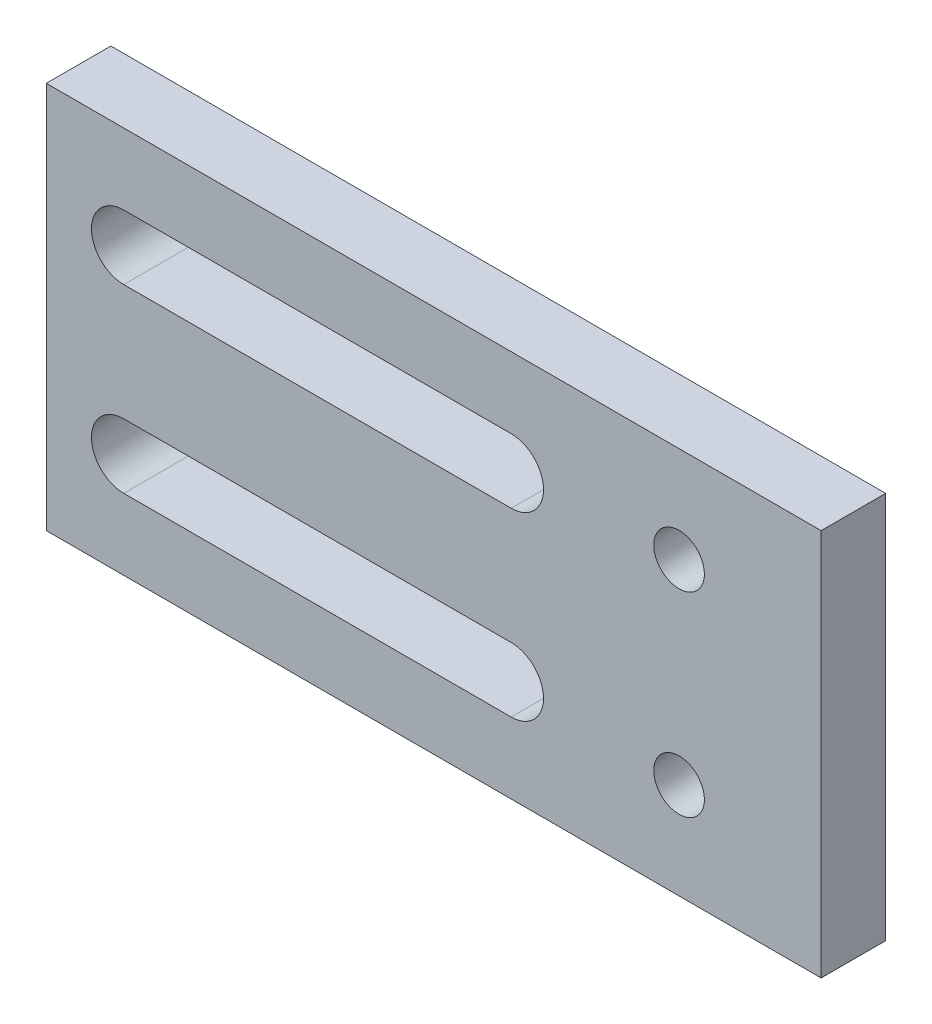
ISO-10303-21;
HEADER;
FILE_DESCRIPTION(('STEP AP214'),'2;1');
FILE_NAME('part.step','',(''),(''),'','','');
FILE_SCHEMA(('AUTOMOTIVE_DESIGN { 1 0 10303 214 1 1 1 1 }'));
ENDSEC;
DATA;
#1=APPLICATION_CONTEXT('core data for automotive mechanical design processes');
#2=APPLICATION_PROTOCOL_DEFINITION('international standard','automotive_design',2000,#1);
#3=PRODUCT_CONTEXT('',#1,'mechanical');
#4=PRODUCT('Part','Part','',(#3));
#5=PRODUCT_RELATED_PRODUCT_CATEGORY('part','',(#4));
#6=PRODUCT_DEFINITION_FORMATION('','',#4);
#7=PRODUCT_DEFINITION_CONTEXT('part definition',#1,'design');
#8=PRODUCT_DEFINITION('design','',#6,#7);
#9=PRODUCT_DEFINITION_SHAPE('','',#8);
#10=(LENGTH_UNIT() NAMED_UNIT(*) SI_UNIT(.MILLI.,.METRE.));
#11=(NAMED_UNIT(*) PLANE_ANGLE_UNIT() SI_UNIT($,.RADIAN.));
#12=(NAMED_UNIT(*) SI_UNIT($,.STERADIAN.) SOLID_ANGLE_UNIT());
#13=UNCERTAINTY_MEASURE_WITH_UNIT(LENGTH_MEASURE(1.E-05),#10,'distance_accuracy_value','');
#14=(GEOMETRIC_REPRESENTATION_CONTEXT(3) GLOBAL_UNCERTAINTY_ASSIGNED_CONTEXT((#13)) GLOBAL_UNIT_ASSIGNED_CONTEXT((#10,
#11,#12)) REPRESENTATION_CONTEXT('',''));
#15=CARTESIAN_POINT('',(0.,0.,0.));
#16=DIRECTION('',(0.,0.,1.));
#17=DIRECTION('',(1.,0.,0.));
#18=AXIS2_PLACEMENT_3D('',#15,#16,#17);
#19=CARTESIAN_POINT('',(0.,2.8575,3.175));
#20=DIRECTION('',(0.,1.,0.));
#21=DIRECTION('',(-1.,0.,0.));
#22=AXIS2_PLACEMENT_3D('',#19,#20,#21);
#23=PLANE('',#22);
#24=DIRECTION('',(1.,0.,0.));
#25=VECTOR('',#24,1.);
#26=CARTESIAN_POINT('',(0.,2.8575,0.));
#27=LINE('',#26,#25);
#28=CARTESIAN_POINT('',(-15.24,2.8575,0.));
#29=VERTEX_POINT('',#28);
#30=CARTESIAN_POINT('',(3.81,2.8575,0.));
#31=VERTEX_POINT('',#30);
#32=EDGE_CURVE('E214',#29,#31,#27,.T.);
#33=ORIENTED_EDGE('',*,*,#32,.F.);
#34=DIRECTION('',(0.,0.,-1.));
#35=VECTOR('',#34,1.);
#36=CARTESIAN_POINT('',(-15.24,2.8575,3.175));
#37=LINE('',#36,#35);
#38=CARTESIAN_POINT('',(-15.24,2.8575,3.175));
#39=VERTEX_POINT('',#38);
#40=EDGE_CURVE('E11',#39,#29,#37,.T.);
#41=ORIENTED_EDGE('',*,*,#40,.F.);
#42=DIRECTION('',(1.,0.,0.));
#43=VECTOR('',#42,1.);
#44=CARTESIAN_POINT('',(0.,2.8575,3.175));
#45=LINE('',#44,#43);
#46=CARTESIAN_POINT('',(3.81,2.8575,3.175));
#47=VERTEX_POINT('',#46);
#48=EDGE_CURVE('E164',#39,#47,#45,.T.);
#49=ORIENTED_EDGE('',*,*,#48,.T.);
#50=DIRECTION('',(0.,0.,-1.));
#51=VECTOR('',#50,1.);
#52=CARTESIAN_POINT('',(3.81,2.8575,3.175));
#53=LINE('',#52,#51);
#54=EDGE_CURVE('E65',#47,#31,#53,.T.);
#55=ORIENTED_EDGE('',*,*,#54,.T.);
#56=EDGE_LOOP('',(#33,#41,#49,#55));
#57=FACE_BOUND('',#56,.T.);
#58=ADVANCED_FACE('F45',(#57),#23,.T.);
#59=CARTESIAN_POINT('',(-15.24,4.445,3.175));
#60=DIRECTION('',(0.,0.,-1.));
#61=DIRECTION('',(-1.,0.,0.));
#62=AXIS2_PLACEMENT_3D('',#59,#60,#61);
#63=CYLINDRICAL_SURFACE('',#62,1.5875);
#64=CARTESIAN_POINT('',(-15.24,4.445,0.));
#65=DIRECTION('',(0.,0.,1.));
#66=DIRECTION('',(1.,0.,0.));
#67=AXIS2_PLACEMENT_3D('',#64,#65,#66);
#68=CIRCLE('',#67,1.5875);
#69=CARTESIAN_POINT('',(-15.24,6.0325,0.));
#70=VERTEX_POINT('',#69);
#71=EDGE_CURVE('E149',#70,#29,#68,.T.);
#72=ORIENTED_EDGE('',*,*,#71,.F.);
#73=DIRECTION('',(0.,0.,-1.));
#74=VECTOR('',#73,1.);
#75=CARTESIAN_POINT('',(-15.24,6.0325,3.175));
#76=LINE('',#75,#74);
#77=CARTESIAN_POINT('',(-15.24,6.0325,3.175));
#78=VERTEX_POINT('',#77);
#79=EDGE_CURVE('E56',#78,#70,#76,.T.);
#80=ORIENTED_EDGE('',*,*,#79,.F.);
#81=CARTESIAN_POINT('',(-15.24,4.445,3.175));
#82=DIRECTION('',(0.,0.,1.));
#83=DIRECTION('',(1.,0.,0.));
#84=AXIS2_PLACEMENT_3D('',#81,#82,#83);
#85=CIRCLE('',#84,1.5875);
#86=EDGE_CURVE('E147',#78,#39,#85,.T.);
#87=ORIENTED_EDGE('',*,*,#86,.T.);
#88=ORIENTED_EDGE('',*,*,#40,.T.);
#89=EDGE_LOOP('',(#72,#80,#87,#88));
#90=FACE_BOUND('',#89,.T.);
#91=ADVANCED_FACE('F145',(#90),#63,.F.);
#92=CARTESIAN_POINT('',(0.,6.0325,3.175));
#93=DIRECTION('',(0.,1.,0.));
#94=DIRECTION('',(0.,0.,1.));
#95=AXIS2_PLACEMENT_3D('',#92,#93,#94);
#96=PLANE('',#95);
#97=DIRECTION('',(1.,0.,0.));
#98=VECTOR('',#97,1.);
#99=CARTESIAN_POINT('',(0.,6.0325,0.));
#100=LINE('',#99,#98);
#101=CARTESIAN_POINT('',(3.81,6.0325,0.));
#102=VERTEX_POINT('',#101);
#103=EDGE_CURVE('E219',#70,#102,#100,.T.);
#104=ORIENTED_EDGE('',*,*,#103,.T.);
#105=DIRECTION('',(0.,0.,-1.));
#106=VECTOR('',#105,1.);
#107=CARTESIAN_POINT('',(3.81,6.0325,3.175));
#108=LINE('',#107,#106);
#109=CARTESIAN_POINT('',(3.81,6.0325,3.175));
#110=VERTEX_POINT('',#109);
#111=EDGE_CURVE('E103',#110,#102,#108,.T.);
#112=ORIENTED_EDGE('',*,*,#111,.F.);
#113=DIRECTION('',(1.,0.,0.));
#114=VECTOR('',#113,1.);
#115=CARTESIAN_POINT('',(0.,6.0325,3.175));
#116=LINE('',#115,#114);
#117=EDGE_CURVE('E154',#78,#110,#116,.T.);
#118=ORIENTED_EDGE('',*,*,#117,.F.);
#119=ORIENTED_EDGE('',*,*,#79,.T.);
#120=EDGE_LOOP('',(#104,#112,#118,#119));
#121=FACE_BOUND('',#120,.T.);
#122=ADVANCED_FACE('F155',(#121),#96,.F.);
#123=CARTESIAN_POINT('',(0.,-6.0325,3.175));
#124=DIRECTION('',(0.,1.,0.));
#125=DIRECTION('',(0.,0.,1.));
#126=AXIS2_PLACEMENT_3D('',#123,#124,#125);
#127=PLANE('',#126);
#128=DIRECTION('',(1.,0.,0.));
#129=VECTOR('',#128,1.);
#130=CARTESIAN_POINT('',(0.,-6.0325,0.));
#131=LINE('',#130,#129);
#132=CARTESIAN_POINT('',(-15.24,-6.0325,0.));
#133=VERTEX_POINT('',#132);
#134=CARTESIAN_POINT('',(3.81,-6.0325,0.));
#135=VERTEX_POINT('',#134);
#136=EDGE_CURVE('E198',#133,#135,#131,.T.);
#137=ORIENTED_EDGE('',*,*,#136,.F.);
#138=DIRECTION('',(0.,0.,-1.));
#139=VECTOR('',#138,1.);
#140=CARTESIAN_POINT('',(-15.24,-6.0325,3.175));
#141=LINE('',#140,#139);
#142=CARTESIAN_POINT('',(-15.24,-6.0325,3.175));
#143=VERTEX_POINT('',#142);
#144=EDGE_CURVE('E232',#143,#133,#141,.T.);
#145=ORIENTED_EDGE('',*,*,#144,.F.);
#146=DIRECTION('',(1.,0.,0.));
#147=VECTOR('',#146,1.);
#148=CARTESIAN_POINT('',(0.,-6.0325,3.175));
#149=LINE('',#148,#147);
#150=CARTESIAN_POINT('',(3.81,-6.0325,3.175));
#151=VERTEX_POINT('',#150);
#152=EDGE_CURVE('E291',#143,#151,#149,.T.);
#153=ORIENTED_EDGE('',*,*,#152,.T.);
#154=DIRECTION('',(0.,0.,-1.));
#155=VECTOR('',#154,1.);
#156=CARTESIAN_POINT('',(3.81,-6.0325,3.175));
#157=LINE('',#156,#155);
#158=EDGE_CURVE('E235',#151,#135,#157,.T.);
#159=ORIENTED_EDGE('',*,*,#158,.T.);
#160=EDGE_LOOP('',(#137,#145,#153,#159));
#161=FACE_BOUND('',#160,.T.);
#162=ADVANCED_FACE('F311',(#161),#127,.T.);
#163=CARTESIAN_POINT('',(-15.24,-4.445,3.175));
#164=DIRECTION('',(0.,0.,-1.));
#165=DIRECTION('',(-1.,0.,0.));
#166=AXIS2_PLACEMENT_3D('',#163,#164,#165);
#167=CYLINDRICAL_SURFACE('',#166,1.5875);
#168=CARTESIAN_POINT('',(-15.24,-4.445,0.));
#169=DIRECTION('',(0.,0.,1.));
#170=DIRECTION('',(1.,0.,0.));
#171=AXIS2_PLACEMENT_3D('',#168,#169,#170);
#172=CIRCLE('',#171,1.5875);
#173=CARTESIAN_POINT('',(-15.24,-2.8575,0.));
#174=VERTEX_POINT('',#173);
#175=EDGE_CURVE('E202',#133,#174,#172,.F.);
#176=ORIENTED_EDGE('',*,*,#175,.T.);
#177=DIRECTION('',(0.,0.,-1.));
#178=VECTOR('',#177,1.);
#179=CARTESIAN_POINT('',(-15.24,-2.8575,3.175));
#180=LINE('',#179,#178);
#181=CARTESIAN_POINT('',(-15.24,-2.8575,3.175));
#182=VERTEX_POINT('',#181);
#183=EDGE_CURVE('E242',#182,#174,#180,.T.);
#184=ORIENTED_EDGE('',*,*,#183,.F.);
#185=CARTESIAN_POINT('',(-15.24,-4.445,3.175));
#186=DIRECTION('',(0.,0.,1.));
#187=DIRECTION('',(1.,0.,0.));
#188=AXIS2_PLACEMENT_3D('',#185,#186,#187);
#189=CIRCLE('',#188,1.5875);
#190=EDGE_CURVE('E295',#143,#182,#189,.F.);
#191=ORIENTED_EDGE('',*,*,#190,.F.);
#192=ORIENTED_EDGE('',*,*,#144,.T.);
#193=EDGE_LOOP('',(#176,#184,#191,#192));
#194=FACE_BOUND('',#193,.T.);
#195=ADVANCED_FACE('F316',(#194),#167,.F.);
#196=CARTESIAN_POINT('',(0.,-2.8575,3.175));
#197=DIRECTION('',(0.,1.,0.));
#198=DIRECTION('',(-1.,0.,0.));
#199=AXIS2_PLACEMENT_3D('',#196,#197,#198);
#200=PLANE('',#199);
#201=DIRECTION('',(1.,0.,0.));
#202=VECTOR('',#201,1.);
#203=CARTESIAN_POINT('',(0.,-2.8575,0.));
#204=LINE('',#203,#202);
#205=CARTESIAN_POINT('',(3.81,-2.8575,0.));
#206=VERTEX_POINT('',#205);
#207=EDGE_CURVE('E206',#174,#206,#204,.T.);
#208=ORIENTED_EDGE('',*,*,#207,.T.);
#209=DIRECTION('',(0.,0.,-1.));
#210=VECTOR('',#209,1.);
#211=CARTESIAN_POINT('',(3.81,-2.8575,3.175));
#212=LINE('',#211,#210);
#213=CARTESIAN_POINT('',(3.81,-2.8575,3.175));
#214=VERTEX_POINT('',#213);
#215=EDGE_CURVE('E238',#214,#206,#212,.T.);
#216=ORIENTED_EDGE('',*,*,#215,.F.);
#217=DIRECTION('',(1.,0.,0.));
#218=VECTOR('',#217,1.);
#219=CARTESIAN_POINT('',(0.,-2.8575,3.175));
#220=LINE('',#219,#218);
#221=EDGE_CURVE('E299',#182,#214,#220,.T.);
#222=ORIENTED_EDGE('',*,*,#221,.F.);
#223=ORIENTED_EDGE('',*,*,#183,.T.);
#224=EDGE_LOOP('',(#208,#216,#222,#223));
#225=FACE_BOUND('',#224,.T.);
#226=ADVANCED_FACE('F318',(#225),#200,.F.);
#227=CARTESIAN_POINT('',(0.,-9.525,3.175));
#228=DIRECTION('',(0.,1.,0.));
#229=DIRECTION('',(0.,0.,1.));
#230=AXIS2_PLACEMENT_3D('',#227,#228,#229);
#231=PLANE('',#230);
#232=DIRECTION('',(1.,0.,0.));
#233=VECTOR('',#232,1.);
#234=CARTESIAN_POINT('',(0.,-9.525,0.));
#235=LINE('',#234,#233);
#236=CARTESIAN_POINT('',(-19.05,-9.525,0.));
#237=VERTEX_POINT('',#236);
#238=CARTESIAN_POINT('',(19.05,-9.525,0.));
#239=VERTEX_POINT('',#238);
#240=EDGE_CURVE('E179',#237,#239,#235,.T.);
#241=ORIENTED_EDGE('',*,*,#240,.T.);
#242=DIRECTION('',(0.,0.,-1.));
#243=VECTOR('',#242,1.);
#244=CARTESIAN_POINT('',(19.05,-9.525,3.175));
#245=LINE('',#244,#243);
#246=CARTESIAN_POINT('',(19.05,-9.525,3.175));
#247=VERTEX_POINT('',#246);
#248=EDGE_CURVE('E49',#247,#239,#245,.T.);
#249=ORIENTED_EDGE('',*,*,#248,.F.);
#250=DIRECTION('',(1.,0.,0.));
#251=VECTOR('',#250,1.);
#252=CARTESIAN_POINT('',(0.,-9.525,3.175));
#253=LINE('',#252,#251);
#254=CARTESIAN_POINT('',(-19.05,-9.525,3.175));
#255=VERTEX_POINT('',#254);
#256=EDGE_CURVE('E116',#255,#247,#253,.T.);
#257=ORIENTED_EDGE('',*,*,#256,.F.);
#258=DIRECTION('',(0.,0.,-1.));
#259=VECTOR('',#258,1.);
#260=CARTESIAN_POINT('',(-19.05,-9.525,3.175));
#261=LINE('',#260,#259);
#262=EDGE_CURVE('E178',#255,#237,#261,.T.);
#263=ORIENTED_EDGE('',*,*,#262,.T.);
#264=EDGE_LOOP('',(#241,#249,#257,#263));
#265=FACE_BOUND('',#264,.T.);
#266=ADVANCED_FACE('F47',(#265),#231,.F.);
#267=CARTESIAN_POINT('',(19.05,0.,3.175));
#268=DIRECTION('',(1.,0.,0.));
#269=DIRECTION('',(0.,0.,-1.));
#270=AXIS2_PLACEMENT_3D('',#267,#268,#269);
#271=PLANE('',#270);
#272=DIRECTION('',(0.,-1.,0.));
#273=VECTOR('',#272,1.);
#274=CARTESIAN_POINT('',(19.05,0.,0.));
#275=LINE('',#274,#273);
#276=CARTESIAN_POINT('',(19.05,9.525,0.));
#277=VERTEX_POINT('',#276);
#278=EDGE_CURVE('E183',#277,#239,#275,.T.);
#279=ORIENTED_EDGE('',*,*,#278,.F.);
#280=DIRECTION('',(0.,0.,-1.));
#281=VECTOR('',#280,1.);
#282=CARTESIAN_POINT('',(19.05,9.525,3.175));
#283=LINE('',#282,#281);
#284=CARTESIAN_POINT('',(19.05,9.525,3.175));
#285=VERTEX_POINT('',#284);
#286=EDGE_CURVE('E253',#285,#277,#283,.T.);
#287=ORIENTED_EDGE('',*,*,#286,.F.);
#288=DIRECTION('',(0.,-1.,0.));
#289=VECTOR('',#288,1.);
#290=CARTESIAN_POINT('',(19.05,0.,3.175));
#291=LINE('',#290,#289);
#292=EDGE_CURVE('E263',#285,#247,#291,.T.);
#293=ORIENTED_EDGE('',*,*,#292,.T.);
#294=ORIENTED_EDGE('',*,*,#248,.T.);
#295=EDGE_LOOP('',(#279,#287,#293,#294));
#296=FACE_BOUND('',#295,.T.);
#297=ADVANCED_FACE('F262',(#296),#271,.T.);
#298=CARTESIAN_POINT('',(0.,9.525,3.175));
#299=DIRECTION('',(0.,1.,0.));
#300=DIRECTION('',(0.,0.,1.));
#301=AXIS2_PLACEMENT_3D('',#298,#299,#300);
#302=PLANE('',#301);
#303=DIRECTION('',(1.,0.,0.));
#304=VECTOR('',#303,1.);
#305=CARTESIAN_POINT('',(0.,9.525,0.));
#306=LINE('',#305,#304);
#307=CARTESIAN_POINT('',(-19.05,9.525,0.));
#308=VERTEX_POINT('',#307);
#309=EDGE_CURVE('E187',#308,#277,#306,.T.);
#310=ORIENTED_EDGE('',*,*,#309,.F.);
#311=DIRECTION('',(0.,0.,-1.));
#312=VECTOR('',#311,1.);
#313=CARTESIAN_POINT('',(-19.05,9.525,3.175));
#314=LINE('',#313,#312);
#315=CARTESIAN_POINT('',(-19.05,9.525,3.175));
#316=VERTEX_POINT('',#315);
#317=EDGE_CURVE('E251',#316,#308,#314,.T.);
#318=ORIENTED_EDGE('',*,*,#317,.F.);
#319=DIRECTION('',(1.,0.,0.));
#320=VECTOR('',#319,1.);
#321=CARTESIAN_POINT('',(0.,9.525,3.175));
#322=LINE('',#321,#320);
#323=EDGE_CURVE('E274',#316,#285,#322,.T.);
#324=ORIENTED_EDGE('',*,*,#323,.T.);
#325=ORIENTED_EDGE('',*,*,#286,.T.);
#326=EDGE_LOOP('',(#310,#318,#324,#325));
#327=FACE_BOUND('',#326,.T.);
#328=ADVANCED_FACE('F271',(#327),#302,.T.);
#329=CARTESIAN_POINT('',(3.81,4.445,3.175));
#330=DIRECTION('',(0.,0.,-1.));
#331=DIRECTION('',(-1.,0.,0.));
#332=AXIS2_PLACEMENT_3D('',#329,#330,#331);
#333=CYLINDRICAL_SURFACE('',#332,1.5875);
#334=CARTESIAN_POINT('',(3.81,4.445,0.));
#335=DIRECTION('',(0.,0.,1.));
#336=DIRECTION('',(1.,0.,0.));
#337=AXIS2_PLACEMENT_3D('',#334,#335,#336);
#338=CIRCLE('',#337,1.5875);
#339=EDGE_CURVE('E222',#31,#102,#338,.T.);
#340=ORIENTED_EDGE('',*,*,#339,.F.);
#341=ORIENTED_EDGE('',*,*,#54,.F.);
#342=CARTESIAN_POINT('',(3.81,4.445,3.175));
#343=DIRECTION('',(0.,0.,1.));
#344=DIRECTION('',(1.,0.,0.));
#345=AXIS2_PLACEMENT_3D('',#342,#343,#344);
#346=CIRCLE('',#345,1.5875);
#347=EDGE_CURVE('E159',#47,#110,#346,.T.);
#348=ORIENTED_EDGE('',*,*,#347,.T.);
#349=ORIENTED_EDGE('',*,*,#111,.T.);
#350=EDGE_LOOP('',(#340,#341,#348,#349));
#351=FACE_BOUND('',#350,.T.);
#352=ADVANCED_FACE('F348',(#351),#333,.F.);
#353=CARTESIAN_POINT('',(3.81,-4.445,3.175));
#354=DIRECTION('',(0.,0.,-1.));
#355=DIRECTION('',(-1.,0.,0.));
#356=AXIS2_PLACEMENT_3D('',#353,#354,#355);
#357=CYLINDRICAL_SURFACE('',#356,1.5875);
#358=CARTESIAN_POINT('',(3.81,-4.445,0.));
#359=DIRECTION('',(0.,0.,1.));
#360=DIRECTION('',(1.,0.,0.));
#361=AXIS2_PLACEMENT_3D('',#358,#359,#360);
#362=CIRCLE('',#361,1.5875);
#363=EDGE_CURVE('E210',#206,#135,#362,.F.);
#364=ORIENTED_EDGE('',*,*,#363,.T.);
#365=ORIENTED_EDGE('',*,*,#158,.F.);
#366=CARTESIAN_POINT('',(3.81,-4.445,3.175));
#367=DIRECTION('',(0.,0.,1.));
#368=DIRECTION('',(1.,0.,0.));
#369=AXIS2_PLACEMENT_3D('',#366,#367,#368);
#370=CIRCLE('',#369,1.5875);
#371=EDGE_CURVE('E168',#214,#151,#370,.F.);
#372=ORIENTED_EDGE('',*,*,#371,.F.);
#373=ORIENTED_EDGE('',*,*,#215,.T.);
#374=EDGE_LOOP('',(#364,#365,#372,#373));
#375=FACE_BOUND('',#374,.T.);
#376=ADVANCED_FACE('F308',(#375),#357,.F.);
#377=CARTESIAN_POINT('',(12.065,-4.8006,3.175));
#378=DIRECTION('',(0.,0.,-1.));
#379=DIRECTION('',(-1.,0.,0.));
#380=AXIS2_PLACEMENT_3D('',#377,#378,#379);
#381=CYLINDRICAL_SURFACE('',#380,1.2446);
#382=CARTESIAN_POINT('',(12.065,-4.8006,3.175));
#383=DIRECTION('',(0.,0.,1.));
#384=DIRECTION('',(1.,0.,0.));
#385=AXIS2_PLACEMENT_3D('',#382,#383,#384);
#386=CIRCLE('',#385,1.2446);
#387=CARTESIAN_POINT('',(13.3096,-4.8006,3.175));
#388=VERTEX_POINT('',#387);
#389=EDGE_CURVE('E279',#388,#388,#386,.T.);
#390=ORIENTED_EDGE('',*,*,#389,.T.);
#391=EDGE_LOOP('',(#390));
#392=FACE_BOUND('',#391,.T.);
#393=CARTESIAN_POINT('',(12.065,-4.8006,0.));
#394=DIRECTION('',(0.,0.,1.));
#395=DIRECTION('',(1.,0.,0.));
#396=AXIS2_PLACEMENT_3D('',#393,#394,#395);
#397=CIRCLE('',#396,1.2446);
#398=CARTESIAN_POINT('',(13.3096,-4.8006,0.));
#399=VERTEX_POINT('',#398);
#400=EDGE_CURVE('E194',#399,#399,#397,.T.);
#401=ORIENTED_EDGE('',*,*,#400,.F.);
#402=EDGE_LOOP('',(#401));
#403=FACE_BOUND('',#402,.T.);
#404=ADVANCED_FACE('F335',(#392,#403),#381,.F.);
#405=CARTESIAN_POINT('',(-19.05,0.,3.175));
#406=DIRECTION('',(1.,0.,0.));
#407=DIRECTION('',(0.,0.,-1.));
#408=AXIS2_PLACEMENT_3D('',#405,#406,#407);
#409=PLANE('',#408);
#410=DIRECTION('',(0.,-1.,0.));
#411=VECTOR('',#410,1.);
#412=CARTESIAN_POINT('',(-19.05,0.,0.));
#413=LINE('',#412,#411);
#414=EDGE_CURVE('E191',#308,#237,#413,.T.);
#415=ORIENTED_EDGE('',*,*,#414,.T.);
#416=ORIENTED_EDGE('',*,*,#262,.F.);
#417=DIRECTION('',(0.,-1.,0.));
#418=VECTOR('',#417,1.);
#419=CARTESIAN_POINT('',(-19.05,0.,3.175));
#420=LINE('',#419,#418);
#421=EDGE_CURVE('E276',#316,#255,#420,.T.);
#422=ORIENTED_EDGE('',*,*,#421,.F.);
#423=ORIENTED_EDGE('',*,*,#317,.T.);
#424=EDGE_LOOP('',(#415,#416,#422,#423));
#425=FACE_BOUND('',#424,.T.);
#426=ADVANCED_FACE('F277',(#425),#409,.F.);
#427=CARTESIAN_POINT('',(12.065,4.8006,3.175));
#428=DIRECTION('',(0.,0.,-1.));
#429=DIRECTION('',(-1.,0.,0.));
#430=AXIS2_PLACEMENT_3D('',#427,#428,#429);
#431=CYLINDRICAL_SURFACE('',#430,1.2446);
#432=CARTESIAN_POINT('',(12.065,4.8006,3.175));
#433=DIRECTION('',(0.,0.,1.));
#434=DIRECTION('',(1.,0.,0.));
#435=AXIS2_PLACEMENT_3D('',#432,#433,#434);
#436=CIRCLE('',#435,1.2446);
#437=CARTESIAN_POINT('',(13.3096,4.8006,3.175));
#438=VERTEX_POINT('',#437);
#439=EDGE_CURVE('E174',#438,#438,#436,.T.);
#440=ORIENTED_EDGE('',*,*,#439,.T.);
#441=EDGE_LOOP('',(#440));
#442=FACE_BOUND('',#441,.T.);
#443=CARTESIAN_POINT('',(12.065,4.8006,0.));
#444=DIRECTION('',(0.,0.,1.));
#445=DIRECTION('',(1.,0.,0.));
#446=AXIS2_PLACEMENT_3D('',#443,#444,#445);
#447=CIRCLE('',#446,1.2446);
#448=CARTESIAN_POINT('',(13.3096,4.8006,0.));
#449=VERTEX_POINT('',#448);
#450=EDGE_CURVE('E226',#449,#449,#447,.T.);
#451=ORIENTED_EDGE('',*,*,#450,.F.);
#452=EDGE_LOOP('',(#451));
#453=FACE_BOUND('',#452,.T.);
#454=ADVANCED_FACE('F326',(#442,#453),#431,.F.);
#455=CARTESIAN_POINT('',(0.,0.,3.175));
#456=DIRECTION('',(0.,0.,1.));
#457=DIRECTION('',(1.,0.,0.));
#458=AXIS2_PLACEMENT_3D('',#455,#456,#457);
#459=PLANE('',#458);
#460=ORIENTED_EDGE('',*,*,#256,.T.);
#461=ORIENTED_EDGE('',*,*,#292,.F.);
#462=ORIENTED_EDGE('',*,*,#323,.F.);
#463=ORIENTED_EDGE('',*,*,#421,.T.);
#464=EDGE_LOOP('',(#460,#461,#462,#463));
#465=FACE_BOUND('',#464,.T.);
#466=ORIENTED_EDGE('',*,*,#389,.F.);
#467=EDGE_LOOP('',(#466));
#468=FACE_BOUND('',#467,.T.);
#469=ORIENTED_EDGE('',*,*,#152,.F.);
#470=ORIENTED_EDGE('',*,*,#190,.T.);
#471=ORIENTED_EDGE('',*,*,#221,.T.);
#472=ORIENTED_EDGE('',*,*,#371,.T.);
#473=EDGE_LOOP('',(#469,#470,#471,#472));
#474=FACE_BOUND('',#473,.T.);
#475=ORIENTED_EDGE('',*,*,#48,.F.);
#476=ORIENTED_EDGE('',*,*,#86,.F.);
#477=ORIENTED_EDGE('',*,*,#117,.T.);
#478=ORIENTED_EDGE('',*,*,#347,.F.);
#479=EDGE_LOOP('',(#475,#476,#477,#478));
#480=FACE_BOUND('',#479,.T.);
#481=ORIENTED_EDGE('',*,*,#439,.F.);
#482=EDGE_LOOP('',(#481));
#483=FACE_BOUND('',#482,.T.);
#484=ADVANCED_FACE('F162',(#465,#468,#474,#480,#483),#459,.T.);
#485=CARTESIAN_POINT('',(0.,0.,0.));
#486=DIRECTION('',(0.,0.,1.));
#487=DIRECTION('',(1.,0.,0.));
#488=AXIS2_PLACEMENT_3D('',#485,#486,#487);
#489=PLANE('',#488);
#490=ORIENTED_EDGE('',*,*,#240,.F.);
#491=ORIENTED_EDGE('',*,*,#414,.F.);
#492=ORIENTED_EDGE('',*,*,#309,.T.);
#493=ORIENTED_EDGE('',*,*,#278,.T.);
#494=EDGE_LOOP('',(#490,#491,#492,#493));
#495=FACE_BOUND('',#494,.T.);
#496=ORIENTED_EDGE('',*,*,#400,.T.);
#497=EDGE_LOOP('',(#496));
#498=FACE_BOUND('',#497,.T.);
#499=ORIENTED_EDGE('',*,*,#136,.T.);
#500=ORIENTED_EDGE('',*,*,#363,.F.);
#501=ORIENTED_EDGE('',*,*,#207,.F.);
#502=ORIENTED_EDGE('',*,*,#175,.F.);
#503=EDGE_LOOP('',(#499,#500,#501,#502));
#504=FACE_BOUND('',#503,.T.);
#505=ORIENTED_EDGE('',*,*,#32,.T.);
#506=ORIENTED_EDGE('',*,*,#339,.T.);
#507=ORIENTED_EDGE('',*,*,#103,.F.);
#508=ORIENTED_EDGE('',*,*,#71,.T.);
#509=EDGE_LOOP('',(#505,#506,#507,#508));
#510=FACE_BOUND('',#509,.T.);
#511=ORIENTED_EDGE('',*,*,#450,.T.);
#512=EDGE_LOOP('',(#511));
#513=FACE_BOUND('',#512,.T.);
#514=ADVANCED_FACE('F269',(#495,#498,#504,#510,#513),#489,.F.);
#515=CLOSED_SHELL('',(#58,#91,#122,#162,#195,#226,#266,#297,#328,#352,#376,#404,#426,#454,#484,#514));
#516=MANIFOLD_SOLID_BREP('B2',#515);
#517=ADVANCED_BREP_SHAPE_REPRESENTATION('',(#18,#516),#14);
#518=SHAPE_DEFINITION_REPRESENTATION(#9,#517);
ENDSEC;
END-ISO-10303-21;
